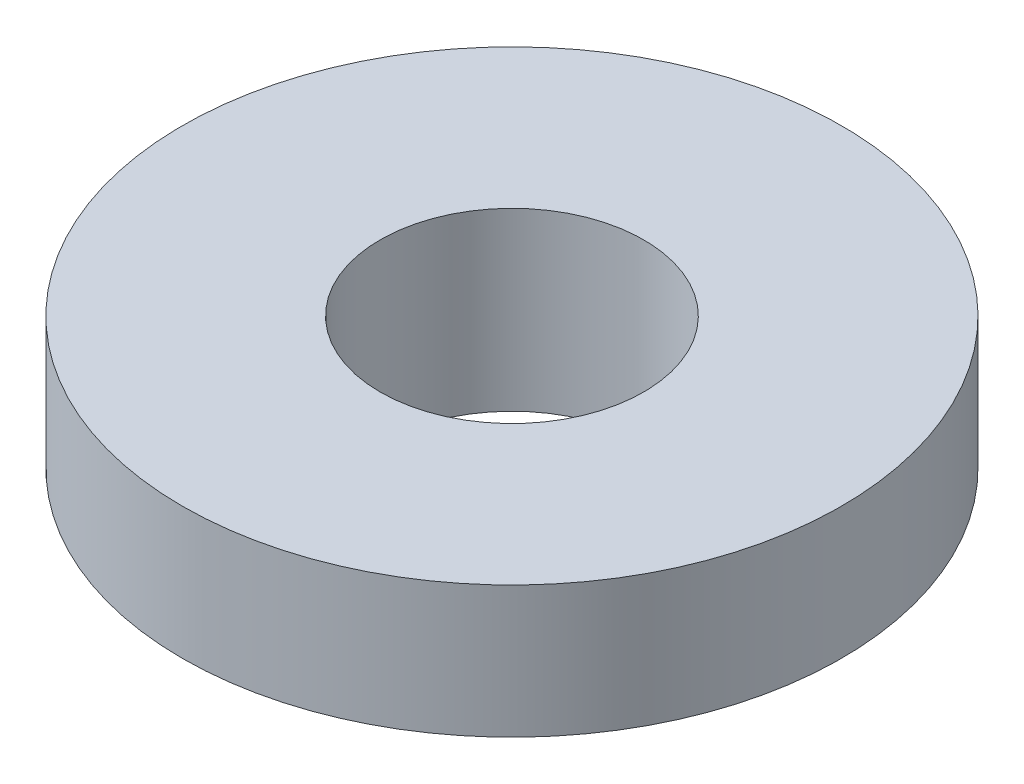
ISO-10303-21;
HEADER;
FILE_DESCRIPTION(('STEP AP214'),'2;1');
FILE_NAME('part.step','',(''),(''),'','','');
FILE_SCHEMA(('AUTOMOTIVE_DESIGN { 1 0 10303 214 1 1 1 1 }'));
ENDSEC;
DATA;
#1=APPLICATION_CONTEXT('core data for automotive mechanical design processes');
#2=APPLICATION_PROTOCOL_DEFINITION('international standard','automotive_design',2000,#1);
#3=PRODUCT_CONTEXT('',#1,'mechanical');
#4=PRODUCT('Part','Part','',(#3));
#5=PRODUCT_RELATED_PRODUCT_CATEGORY('part','',(#4));
#6=PRODUCT_DEFINITION_FORMATION('','',#4);
#7=PRODUCT_DEFINITION_CONTEXT('part definition',#1,'design');
#8=PRODUCT_DEFINITION('design','',#6,#7);
#9=PRODUCT_DEFINITION_SHAPE('','',#8);
#10=(LENGTH_UNIT() NAMED_UNIT(*) SI_UNIT(.MILLI.,.METRE.));
#11=(NAMED_UNIT(*) PLANE_ANGLE_UNIT() SI_UNIT($,.RADIAN.));
#12=(NAMED_UNIT(*) SI_UNIT($,.STERADIAN.) SOLID_ANGLE_UNIT());
#13=UNCERTAINTY_MEASURE_WITH_UNIT(LENGTH_MEASURE(1.E-05),#10,'distance_accuracy_value','');
#14=(GEOMETRIC_REPRESENTATION_CONTEXT(3) GLOBAL_UNCERTAINTY_ASSIGNED_CONTEXT((#13)) GLOBAL_UNIT_ASSIGNED_CONTEXT((#10,
#11,#12)) REPRESENTATION_CONTEXT('',''));
#15=CARTESIAN_POINT('',(0.,0.,0.));
#16=DIRECTION('',(0.,0.,1.));
#17=DIRECTION('',(1.,0.,0.));
#18=AXIS2_PLACEMENT_3D('',#15,#16,#17);
#19=CARTESIAN_POINT('',(0.,1.5,0.));
#20=DIRECTION('',(0.,-1.,0.));
#21=DIRECTION('',(0.,0.,-1.));
#22=AXIS2_PLACEMENT_3D('',#19,#20,#21);
#23=CYLINDRICAL_SURFACE('',#22,3.75);
#24=CARTESIAN_POINT('',(0.,1.5,0.));
#25=DIRECTION('',(0.,1.,0.));
#26=DIRECTION('',(0.,0.,1.));
#27=AXIS2_PLACEMENT_3D('',#24,#25,#26);
#28=CIRCLE('',#27,3.75);
#29=CARTESIAN_POINT('',(0.,1.5,3.75));
#30=VERTEX_POINT('',#29);
#31=EDGE_CURVE('E50',#30,#30,#28,.T.);
#32=ORIENTED_EDGE('',*,*,#31,.F.);
#33=EDGE_LOOP('',(#32));
#34=FACE_BOUND('',#33,.T.);
#35=CARTESIAN_POINT('',(0.,0.,0.));
#36=DIRECTION('',(0.,1.,0.));
#37=DIRECTION('',(0.,0.,1.));
#38=AXIS2_PLACEMENT_3D('',#35,#36,#37);
#39=CIRCLE('',#38,3.75);
#40=CARTESIAN_POINT('',(0.,0.,3.75));
#41=VERTEX_POINT('',#40);
#42=EDGE_CURVE('E46',#41,#41,#39,.T.);
#43=ORIENTED_EDGE('',*,*,#42,.T.);
#44=EDGE_LOOP('',(#43));
#45=FACE_BOUND('',#44,.T.);
#46=ADVANCED_FACE('F43',(#34,#45),#23,.T.);
#47=CARTESIAN_POINT('',(0.,1.5,0.));
#48=DIRECTION('',(0.,-1.,0.));
#49=DIRECTION('',(0.,0.,-1.));
#50=AXIS2_PLACEMENT_3D('',#47,#48,#49);
#51=CYLINDRICAL_SURFACE('',#50,1.5);
#52=CARTESIAN_POINT('',(0.,1.5,0.));
#53=DIRECTION('',(0.,1.,0.));
#54=DIRECTION('',(0.,0.,1.));
#55=AXIS2_PLACEMENT_3D('',#52,#53,#54);
#56=CIRCLE('',#55,1.5);
#57=CARTESIAN_POINT('',(0.,1.5,1.5));
#58=VERTEX_POINT('',#57);
#59=EDGE_CURVE('E11',#58,#58,#56,.T.);
#60=ORIENTED_EDGE('',*,*,#59,.T.);
#61=EDGE_LOOP('',(#60));
#62=FACE_BOUND('',#61,.T.);
#63=CARTESIAN_POINT('',(0.,-0.5,0.));
#64=DIRECTION('',(0.,1.,0.));
#65=DIRECTION('',(0.,0.,1.));
#66=AXIS2_PLACEMENT_3D('',#63,#64,#65);
#67=CIRCLE('',#66,1.5);
#68=CARTESIAN_POINT('',(0.,-0.5,1.5));
#69=VERTEX_POINT('',#68);
#70=EDGE_CURVE('E60',#69,#69,#67,.T.);
#71=ORIENTED_EDGE('',*,*,#70,.F.);
#72=EDGE_LOOP('',(#71));
#73=FACE_BOUND('',#72,.T.);
#74=ADVANCED_FACE('F69',(#62,#73),#51,.F.);
#75=CARTESIAN_POINT('',(0.,1.5,0.));
#76=DIRECTION('',(0.,1.,0.));
#77=DIRECTION('',(0.,0.,1.));
#78=AXIS2_PLACEMENT_3D('',#75,#76,#77);
#79=PLANE('',#78);
#80=ORIENTED_EDGE('',*,*,#31,.T.);
#81=EDGE_LOOP('',(#80));
#82=FACE_BOUND('',#81,.T.);
#83=ORIENTED_EDGE('',*,*,#59,.F.);
#84=EDGE_LOOP('',(#83));
#85=FACE_BOUND('',#84,.T.);
#86=ADVANCED_FACE('F71',(#82,#85),#79,.T.);
#87=CARTESIAN_POINT('',(0.,0.,0.));
#88=DIRECTION('',(0.,1.,0.));
#89=DIRECTION('',(0.,0.,1.));
#90=AXIS2_PLACEMENT_3D('',#87,#88,#89);
#91=PLANE('',#90);
#92=CARTESIAN_POINT('',(0.,0.,0.));
#93=DIRECTION('',(0.,1.,0.));
#94=DIRECTION('',(0.,0.,1.));
#95=AXIS2_PLACEMENT_3D('',#92,#93,#94);
#96=CIRCLE('',#95,2.5);
#97=CARTESIAN_POINT('',(0.,0.,2.5));
#98=VERTEX_POINT('',#97);
#99=EDGE_CURVE('E56',#98,#98,#96,.T.);
#100=ORIENTED_EDGE('',*,*,#99,.T.);
#101=EDGE_LOOP('',(#100));
#102=FACE_BOUND('',#101,.T.);
#103=ORIENTED_EDGE('',*,*,#42,.F.);
#104=EDGE_LOOP('',(#103));
#105=FACE_BOUND('',#104,.T.);
#106=ADVANCED_FACE('F76',(#102,#105),#91,.F.);
#107=CARTESIAN_POINT('',(0.,-0.5,0.));
#108=DIRECTION('',(0.,1.,0.));
#109=DIRECTION('',(0.,0.,1.));
#110=AXIS2_PLACEMENT_3D('',#107,#108,#109);
#111=CYLINDRICAL_SURFACE('',#110,2.5);
#112=CARTESIAN_POINT('',(0.,-0.5,0.));
#113=DIRECTION('',(0.,1.,0.));
#114=DIRECTION('',(0.,0.,1.));
#115=AXIS2_PLACEMENT_3D('',#112,#113,#114);
#116=CIRCLE('',#115,2.5);
#117=CARTESIAN_POINT('',(0.,-0.5,2.5));
#118=VERTEX_POINT('',#117);
#119=EDGE_CURVE('E59',#118,#118,#116,.T.);
#120=ORIENTED_EDGE('',*,*,#119,.T.);
#121=EDGE_LOOP('',(#120));
#122=FACE_BOUND('',#121,.T.);
#123=ORIENTED_EDGE('',*,*,#99,.F.);
#124=EDGE_LOOP('',(#123));
#125=FACE_BOUND('',#124,.T.);
#126=ADVANCED_FACE('F82',(#122,#125),#111,.T.);
#127=CARTESIAN_POINT('',(0.,-0.5,0.));
#128=DIRECTION('',(0.,1.,0.));
#129=DIRECTION('',(0.,0.,1.));
#130=AXIS2_PLACEMENT_3D('',#127,#128,#129);
#131=PLANE('',#130);
#132=ORIENTED_EDGE('',*,*,#70,.T.);
#133=EDGE_LOOP('',(#132));
#134=FACE_BOUND('',#133,.T.);
#135=ORIENTED_EDGE('',*,*,#119,.F.);
#136=EDGE_LOOP('',(#135));
#137=FACE_BOUND('',#136,.T.);
#138=ADVANCED_FACE('F66',(#134,#137),#131,.F.);
#139=CLOSED_SHELL('',(#46,#74,#86,#106,#126,#138));
#140=MANIFOLD_SOLID_BREP('B2',#139);
#141=ADVANCED_BREP_SHAPE_REPRESENTATION('',(#18,#140),#14);
#142=SHAPE_DEFINITION_REPRESENTATION(#9,#141);
ENDSEC;
END-ISO-10303-21;
